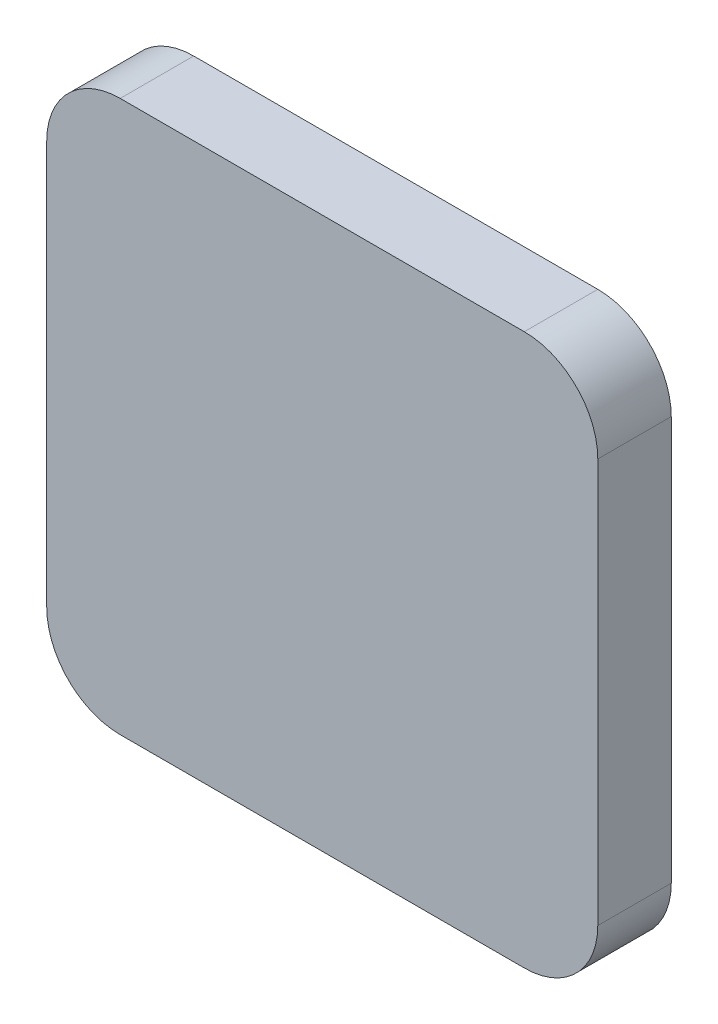
ISO-10303-21;
HEADER;
FILE_DESCRIPTION(('STEP AP214'),'2;1');
FILE_NAME('part.step','',(''),(''),'','','');
FILE_SCHEMA(('AUTOMOTIVE_DESIGN { 1 0 10303 214 1 1 1 1 }'));
ENDSEC;
DATA;
#1=APPLICATION_CONTEXT('core data for automotive mechanical design processes');
#2=APPLICATION_PROTOCOL_DEFINITION('international standard','automotive_design',2000,#1);
#3=PRODUCT_CONTEXT('',#1,'mechanical');
#4=PRODUCT('Part','Part','',(#3));
#5=PRODUCT_RELATED_PRODUCT_CATEGORY('part','',(#4));
#6=PRODUCT_DEFINITION_FORMATION('','',#4);
#7=PRODUCT_DEFINITION_CONTEXT('part definition',#1,'design');
#8=PRODUCT_DEFINITION('design','',#6,#7);
#9=PRODUCT_DEFINITION_SHAPE('','',#8);
#10=(LENGTH_UNIT() NAMED_UNIT(*) SI_UNIT(.MILLI.,.METRE.));
#11=(NAMED_UNIT(*) PLANE_ANGLE_UNIT() SI_UNIT($,.RADIAN.));
#12=(NAMED_UNIT(*) SI_UNIT($,.STERADIAN.) SOLID_ANGLE_UNIT());
#13=UNCERTAINTY_MEASURE_WITH_UNIT(LENGTH_MEASURE(1.E-05),#10,'distance_accuracy_value','');
#14=(GEOMETRIC_REPRESENTATION_CONTEXT(3) GLOBAL_UNCERTAINTY_ASSIGNED_CONTEXT((#13)) GLOBAL_UNIT_ASSIGNED_CONTEXT((#10,
#11,#12)) REPRESENTATION_CONTEXT('',''));
#15=CARTESIAN_POINT('',(0.,0.,0.));
#16=DIRECTION('',(0.,0.,1.));
#17=DIRECTION('',(1.,0.,0.));
#18=AXIS2_PLACEMENT_3D('',#15,#16,#17);
#19=CARTESIAN_POINT('',(-19.7016831050969,-21.7228972814431,2.));
#20=DIRECTION('',(0.,0.,-1.));
#21=DIRECTION('',(-1.,0.,0.));
#22=AXIS2_PLACEMENT_3D('',#19,#20,#21);
#23=CYLINDRICAL_SURFACE('',#22,2.);
#24=CARTESIAN_POINT('',(-19.7016831050969,-21.7228972814431,0.));
#25=DIRECTION('',(0.,0.,1.));
#26=DIRECTION('',(-1.,0.,0.));
#27=AXIS2_PLACEMENT_3D('',#24,#25,#26);
#28=CIRCLE('',#27,2.);
#29=CARTESIAN_POINT('',(-19.7016831050969,-23.7228972814431,0.));
#30=VERTEX_POINT('',#29);
#31=CARTESIAN_POINT('',(-17.7016831050969,-21.7228972814431,0.));
#32=VERTEX_POINT('',#31);
#33=EDGE_CURVE('E128',#30,#32,#28,.T.);
#34=ORIENTED_EDGE('',*,*,#33,.T.);
#35=DIRECTION('',(0.,0.,-1.));
#36=VECTOR('',#35,1.);
#37=CARTESIAN_POINT('',(-17.7016831050969,-21.7228972814431,2.));
#38=LINE('',#37,#36);
#39=CARTESIAN_POINT('',(-17.7016831050969,-21.7228972814431,2.));
#40=VERTEX_POINT('',#39);
#41=EDGE_CURVE('E11',#40,#32,#38,.T.);
#42=ORIENTED_EDGE('',*,*,#41,.F.);
#43=CARTESIAN_POINT('',(-19.7016831050969,-21.7228972814431,2.));
#44=DIRECTION('',(0.,0.,1.));
#45=DIRECTION('',(-1.,0.,0.));
#46=AXIS2_PLACEMENT_3D('',#43,#44,#45);
#47=CIRCLE('',#46,2.);
#48=CARTESIAN_POINT('',(-19.7016831050969,-23.7228972814431,2.));
#49=VERTEX_POINT('',#48);
#50=EDGE_CURVE('E142',#49,#40,#47,.T.);
#51=ORIENTED_EDGE('',*,*,#50,.F.);
#52=DIRECTION('',(0.,0.,-1.));
#53=VECTOR('',#52,1.);
#54=CARTESIAN_POINT('',(-19.7016831050969,-23.7228972814431,2.));
#55=LINE('',#54,#53);
#56=EDGE_CURVE('E124',#49,#30,#55,.T.);
#57=ORIENTED_EDGE('',*,*,#56,.T.);
#58=EDGE_LOOP('',(#34,#42,#51,#57));
#59=FACE_BOUND('',#58,.T.);
#60=ADVANCED_FACE('F32',(#59),#23,.T.);
#61=CARTESIAN_POINT('',(-17.7016831050969,-10.7228972814431,2.));
#62=DIRECTION('',(-1.,0.,0.));
#63=DIRECTION('',(0.,-1.,0.));
#64=AXIS2_PLACEMENT_3D('',#61,#62,#63);
#65=PLANE('',#64);
#66=DIRECTION('',(0.,1.,0.));
#67=VECTOR('',#66,1.);
#68=CARTESIAN_POINT('',(-17.7016831050969,-10.7228972814431,0.));
#69=LINE('',#68,#67);
#70=CARTESIAN_POINT('',(-17.7016831050969,-10.7228972814431,0.));
#71=VERTEX_POINT('',#70);
#72=EDGE_CURVE('E131',#32,#71,#69,.T.);
#73=ORIENTED_EDGE('',*,*,#72,.T.);
#74=DIRECTION('',(0.,0.,-1.));
#75=VECTOR('',#74,1.);
#76=CARTESIAN_POINT('',(-17.7016831050969,-10.7228972814431,2.));
#77=LINE('',#76,#75);
#78=CARTESIAN_POINT('',(-17.7016831050969,-10.7228972814431,2.));
#79=VERTEX_POINT('',#78);
#80=EDGE_CURVE('E40',#79,#71,#77,.T.);
#81=ORIENTED_EDGE('',*,*,#80,.F.);
#82=DIRECTION('',(0.,1.,0.));
#83=VECTOR('',#82,1.);
#84=CARTESIAN_POINT('',(-17.7016831050969,-10.7228972814431,2.));
#85=LINE('',#84,#83);
#86=EDGE_CURVE('E91',#40,#79,#85,.T.);
#87=ORIENTED_EDGE('',*,*,#86,.F.);
#88=ORIENTED_EDGE('',*,*,#41,.T.);
#89=EDGE_LOOP('',(#73,#81,#87,#88));
#90=FACE_BOUND('',#89,.T.);
#91=ADVANCED_FACE('F177',(#90),#65,.F.);
#92=CARTESIAN_POINT('',(-19.7016831050969,-10.7228972814431,2.));
#93=DIRECTION('',(0.,0.,-1.));
#94=DIRECTION('',(-1.,0.,0.));
#95=AXIS2_PLACEMENT_3D('',#92,#93,#94);
#96=CYLINDRICAL_SURFACE('',#95,2.);
#97=CARTESIAN_POINT('',(-19.7016831050969,-10.7228972814431,0.));
#98=DIRECTION('',(0.,0.,1.));
#99=DIRECTION('',(-1.,0.,0.));
#100=AXIS2_PLACEMENT_3D('',#97,#98,#99);
#101=CIRCLE('',#100,2.);
#102=CARTESIAN_POINT('',(-19.7016831050969,-8.72289728144311,0.));
#103=VERTEX_POINT('',#102);
#104=EDGE_CURVE('E133',#71,#103,#101,.T.);
#105=ORIENTED_EDGE('',*,*,#104,.T.);
#106=DIRECTION('',(0.,0.,-1.));
#107=VECTOR('',#106,1.);
#108=CARTESIAN_POINT('',(-19.7016831050969,-8.72289728144311,2.));
#109=LINE('',#108,#107);
#110=CARTESIAN_POINT('',(-19.7016831050969,-8.72289728144311,2.));
#111=VERTEX_POINT('',#110);
#112=EDGE_CURVE('E149',#111,#103,#109,.T.);
#113=ORIENTED_EDGE('',*,*,#112,.F.);
#114=CARTESIAN_POINT('',(-19.7016831050969,-10.7228972814431,2.));
#115=DIRECTION('',(0.,0.,1.));
#116=DIRECTION('',(-1.,0.,0.));
#117=AXIS2_PLACEMENT_3D('',#114,#115,#116);
#118=CIRCLE('',#117,2.);
#119=EDGE_CURVE('E157',#79,#111,#118,.T.);
#120=ORIENTED_EDGE('',*,*,#119,.F.);
#121=ORIENTED_EDGE('',*,*,#80,.T.);
#122=EDGE_LOOP('',(#105,#113,#120,#121));
#123=FACE_BOUND('',#122,.T.);
#124=ADVANCED_FACE('F155',(#123),#96,.T.);
#125=CARTESIAN_POINT('',(-30.7016831050969,-8.72289728144311,2.));
#126=DIRECTION('',(0.,-1.,0.));
#127=DIRECTION('',(0.,0.,-1.));
#128=AXIS2_PLACEMENT_3D('',#125,#126,#127);
#129=PLANE('',#128);
#130=DIRECTION('',(-1.,0.,0.));
#131=VECTOR('',#130,1.);
#132=CARTESIAN_POINT('',(-30.7016831050969,-8.72289728144311,0.));
#133=LINE('',#132,#131);
#134=CARTESIAN_POINT('',(-30.7016831050969,-8.72289728144311,0.));
#135=VERTEX_POINT('',#134);
#136=EDGE_CURVE('E135',#103,#135,#133,.T.);
#137=ORIENTED_EDGE('',*,*,#136,.T.);
#138=DIRECTION('',(0.,0.,-1.));
#139=VECTOR('',#138,1.);
#140=CARTESIAN_POINT('',(-30.7016831050969,-8.72289728144311,2.));
#141=LINE('',#140,#139);
#142=CARTESIAN_POINT('',(-30.7016831050969,-8.72289728144311,2.));
#143=VERTEX_POINT('',#142);
#144=EDGE_CURVE('E146',#143,#135,#141,.T.);
#145=ORIENTED_EDGE('',*,*,#144,.F.);
#146=DIRECTION('',(-1.,0.,0.));
#147=VECTOR('',#146,1.);
#148=CARTESIAN_POINT('',(-30.7016831050969,-8.72289728144311,2.));
#149=LINE('',#148,#147);
#150=EDGE_CURVE('E169',#111,#143,#149,.T.);
#151=ORIENTED_EDGE('',*,*,#150,.F.);
#152=ORIENTED_EDGE('',*,*,#112,.T.);
#153=EDGE_LOOP('',(#137,#145,#151,#152));
#154=FACE_BOUND('',#153,.T.);
#155=ADVANCED_FACE('F165',(#154),#129,.F.);
#156=CARTESIAN_POINT('',(-30.7016831050969,-10.7228972814431,2.));
#157=DIRECTION('',(0.,0.,-1.));
#158=DIRECTION('',(-1.,0.,0.));
#159=AXIS2_PLACEMENT_3D('',#156,#157,#158);
#160=CYLINDRICAL_SURFACE('',#159,2.);
#161=CARTESIAN_POINT('',(-30.7016831050969,-10.7228972814431,0.));
#162=DIRECTION('',(0.,0.,1.));
#163=DIRECTION('',(-1.,0.,0.));
#164=AXIS2_PLACEMENT_3D('',#161,#162,#163);
#165=CIRCLE('',#164,2.);
#166=CARTESIAN_POINT('',(-32.7016831050969,-10.7228972814431,0.));
#167=VERTEX_POINT('',#166);
#168=EDGE_CURVE('E137',#135,#167,#165,.T.);
#169=ORIENTED_EDGE('',*,*,#168,.T.);
#170=DIRECTION('',(0.,0.,-1.));
#171=VECTOR('',#170,1.);
#172=CARTESIAN_POINT('',(-32.7016831050969,-10.7228972814431,2.));
#173=LINE('',#172,#171);
#174=CARTESIAN_POINT('',(-32.7016831050969,-10.7228972814431,2.));
#175=VERTEX_POINT('',#174);
#176=EDGE_CURVE('E119',#175,#167,#173,.T.);
#177=ORIENTED_EDGE('',*,*,#176,.F.);
#178=CARTESIAN_POINT('',(-30.7016831050969,-10.7228972814431,2.));
#179=DIRECTION('',(0.,0.,1.));
#180=DIRECTION('',(-1.,0.,0.));
#181=AXIS2_PLACEMENT_3D('',#178,#179,#180);
#182=CIRCLE('',#181,2.);
#183=EDGE_CURVE('E110',#143,#175,#182,.T.);
#184=ORIENTED_EDGE('',*,*,#183,.F.);
#185=ORIENTED_EDGE('',*,*,#144,.T.);
#186=EDGE_LOOP('',(#169,#177,#184,#185));
#187=FACE_BOUND('',#186,.T.);
#188=ADVANCED_FACE('F168',(#187),#160,.T.);
#189=CARTESIAN_POINT('',(-32.7016831050969,-10.7228972814431,2.));
#190=DIRECTION('',(1.,0.,0.));
#191=DIRECTION('',(0.,0.,-1.));
#192=AXIS2_PLACEMENT_3D('',#189,#190,#191);
#193=PLANE('',#192);
#194=DIRECTION('',(0.,-1.,0.));
#195=VECTOR('',#194,1.);
#196=CARTESIAN_POINT('',(-32.7016831050969,-10.7228972814431,0.));
#197=LINE('',#196,#195);
#198=CARTESIAN_POINT('',(-32.7016831050969,-21.7228972814431,0.));
#199=VERTEX_POINT('',#198);
#200=EDGE_CURVE('E118',#167,#199,#197,.T.);
#201=ORIENTED_EDGE('',*,*,#200,.T.);
#202=DIRECTION('',(0.,0.,-1.));
#203=VECTOR('',#202,1.);
#204=CARTESIAN_POINT('',(-32.7016831050969,-21.7228972814431,2.));
#205=LINE('',#204,#203);
#206=CARTESIAN_POINT('',(-32.7016831050969,-21.7228972814431,2.));
#207=VERTEX_POINT('',#206);
#208=EDGE_CURVE('E115',#207,#199,#205,.T.);
#209=ORIENTED_EDGE('',*,*,#208,.F.);
#210=DIRECTION('',(0.,-1.,0.));
#211=VECTOR('',#210,1.);
#212=CARTESIAN_POINT('',(-32.7016831050969,-10.7228972814431,2.));
#213=LINE('',#212,#211);
#214=EDGE_CURVE('E104',#175,#207,#213,.T.);
#215=ORIENTED_EDGE('',*,*,#214,.F.);
#216=ORIENTED_EDGE('',*,*,#176,.T.);
#217=EDGE_LOOP('',(#201,#209,#215,#216));
#218=FACE_BOUND('',#217,.T.);
#219=ADVANCED_FACE('F116',(#218),#193,.F.);
#220=CARTESIAN_POINT('',(-30.7016831050969,-21.7228972814431,2.));
#221=DIRECTION('',(0.,0.,-1.));
#222=DIRECTION('',(-1.,0.,0.));
#223=AXIS2_PLACEMENT_3D('',#220,#221,#222);
#224=CYLINDRICAL_SURFACE('',#223,2.);
#225=CARTESIAN_POINT('',(-30.7016831050969,-21.7228972814431,0.));
#226=DIRECTION('',(0.,0.,1.));
#227=DIRECTION('',(-1.,0.,0.));
#228=AXIS2_PLACEMENT_3D('',#225,#226,#227);
#229=CIRCLE('',#228,2.);
#230=CARTESIAN_POINT('',(-30.7016831050969,-23.7228972814431,0.));
#231=VERTEX_POINT('',#230);
#232=EDGE_CURVE('E77',#199,#231,#229,.T.);
#233=ORIENTED_EDGE('',*,*,#232,.T.);
#234=DIRECTION('',(0.,0.,-1.));
#235=VECTOR('',#234,1.);
#236=CARTESIAN_POINT('',(-30.7016831050969,-23.7228972814431,2.));
#237=LINE('',#236,#235);
#238=CARTESIAN_POINT('',(-30.7016831050969,-23.7228972814431,2.));
#239=VERTEX_POINT('',#238);
#240=EDGE_CURVE('E120',#239,#231,#237,.T.);
#241=ORIENTED_EDGE('',*,*,#240,.F.);
#242=CARTESIAN_POINT('',(-30.7016831050969,-21.7228972814431,2.));
#243=DIRECTION('',(0.,0.,1.));
#244=DIRECTION('',(-1.,0.,0.));
#245=AXIS2_PLACEMENT_3D('',#242,#243,#244);
#246=CIRCLE('',#245,2.);
#247=EDGE_CURVE('E108',#207,#239,#246,.T.);
#248=ORIENTED_EDGE('',*,*,#247,.F.);
#249=ORIENTED_EDGE('',*,*,#208,.T.);
#250=EDGE_LOOP('',(#233,#241,#248,#249));
#251=FACE_BOUND('',#250,.T.);
#252=ADVANCED_FACE('F122',(#251),#224,.T.);
#253=CARTESIAN_POINT('',(-30.7016831050969,-23.7228972814431,2.));
#254=DIRECTION('',(0.,1.,0.));
#255=DIRECTION('',(0.,0.,1.));
#256=AXIS2_PLACEMENT_3D('',#253,#254,#255);
#257=PLANE('',#256);
#258=DIRECTION('',(1.,0.,0.));
#259=VECTOR('',#258,1.);
#260=CARTESIAN_POINT('',(-30.7016831050969,-23.7228972814431,0.));
#261=LINE('',#260,#259);
#262=EDGE_CURVE('E83',#231,#30,#261,.T.);
#263=ORIENTED_EDGE('',*,*,#262,.T.);
#264=ORIENTED_EDGE('',*,*,#56,.F.);
#265=DIRECTION('',(1.,0.,0.));
#266=VECTOR('',#265,1.);
#267=CARTESIAN_POINT('',(-30.7016831050969,-23.7228972814431,2.));
#268=LINE('',#267,#266);
#269=EDGE_CURVE('E48',#239,#49,#268,.T.);
#270=ORIENTED_EDGE('',*,*,#269,.F.);
#271=ORIENTED_EDGE('',*,*,#240,.T.);
#272=EDGE_LOOP('',(#263,#264,#270,#271));
#273=FACE_BOUND('',#272,.T.);
#274=ADVANCED_FACE('F193',(#273),#257,.F.);
#275=CARTESIAN_POINT('',(-19.7016831050969,-21.7228972814431,2.));
#276=DIRECTION('',(0.,0.,-1.));
#277=DIRECTION('',(-1.,0.,0.));
#278=AXIS2_PLACEMENT_3D('',#275,#276,#277);
#279=PLANE('',#278);
#280=ORIENTED_EDGE('',*,*,#50,.T.);
#281=ORIENTED_EDGE('',*,*,#86,.T.);
#282=ORIENTED_EDGE('',*,*,#119,.T.);
#283=ORIENTED_EDGE('',*,*,#150,.T.);
#284=ORIENTED_EDGE('',*,*,#183,.T.);
#285=ORIENTED_EDGE('',*,*,#214,.T.);
#286=ORIENTED_EDGE('',*,*,#247,.T.);
#287=ORIENTED_EDGE('',*,*,#269,.T.);
#288=EDGE_LOOP('',(#280,#281,#282,#283,#284,#285,#286,#287));
#289=FACE_BOUND('',#288,.T.);
#290=ADVANCED_FACE('F106',(#289),#279,.F.);
#291=CARTESIAN_POINT('',(-19.7016831050969,-21.7228972814431,0.));
#292=DIRECTION('',(0.,0.,-1.));
#293=DIRECTION('',(-1.,0.,0.));
#294=AXIS2_PLACEMENT_3D('',#291,#292,#293);
#295=PLANE('',#294);
#296=ORIENTED_EDGE('',*,*,#33,.F.);
#297=ORIENTED_EDGE('',*,*,#262,.F.);
#298=ORIENTED_EDGE('',*,*,#232,.F.);
#299=ORIENTED_EDGE('',*,*,#200,.F.);
#300=ORIENTED_EDGE('',*,*,#168,.F.);
#301=ORIENTED_EDGE('',*,*,#136,.F.);
#302=ORIENTED_EDGE('',*,*,#104,.F.);
#303=ORIENTED_EDGE('',*,*,#72,.F.);
#304=EDGE_LOOP('',(#296,#297,#298,#299,#300,#301,#302,#303));
#305=FACE_BOUND('',#304,.T.);
#306=ADVANCED_FACE('F161',(#305),#295,.T.);
#307=CLOSED_SHELL('',(#60,#91,#124,#155,#188,#219,#252,#274,#290,#306));
#308=MANIFOLD_SOLID_BREP('B2',#307);
#309=ADVANCED_BREP_SHAPE_REPRESENTATION('',(#18,#308),#14);
#310=SHAPE_DEFINITION_REPRESENTATION(#9,#309);
ENDSEC;
END-ISO-10303-21;
